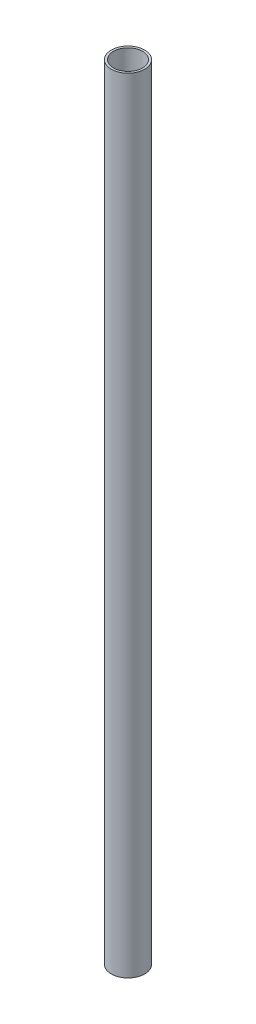
ISO-10303-21;
HEADER;
FILE_DESCRIPTION(('STEP AP214'),'2;1');
FILE_NAME('part.step','',(''),(''),'','','');
FILE_SCHEMA(('AUTOMOTIVE_DESIGN { 1 0 10303 214 1 1 1 1 }'));
ENDSEC;
DATA;
#1=APPLICATION_CONTEXT('core data for automotive mechanical design processes');
#2=APPLICATION_PROTOCOL_DEFINITION('international standard','automotive_design',2000,#1);
#3=PRODUCT_CONTEXT('',#1,'mechanical');
#4=PRODUCT('Part','Part','',(#3));
#5=PRODUCT_RELATED_PRODUCT_CATEGORY('part','',(#4));
#6=PRODUCT_DEFINITION_FORMATION('','',#4);
#7=PRODUCT_DEFINITION_CONTEXT('part definition',#1,'design');
#8=PRODUCT_DEFINITION('design','',#6,#7);
#9=PRODUCT_DEFINITION_SHAPE('','',#8);
#10=(LENGTH_UNIT() NAMED_UNIT(*) SI_UNIT(.MILLI.,.METRE.));
#11=(NAMED_UNIT(*) PLANE_ANGLE_UNIT() SI_UNIT($,.RADIAN.));
#12=(NAMED_UNIT(*) SI_UNIT($,.STERADIAN.) SOLID_ANGLE_UNIT());
#13=UNCERTAINTY_MEASURE_WITH_UNIT(LENGTH_MEASURE(1.E-05),#10,'distance_accuracy_value','');
#14=(GEOMETRIC_REPRESENTATION_CONTEXT(3) GLOBAL_UNCERTAINTY_ASSIGNED_CONTEXT((#13)) GLOBAL_UNIT_ASSIGNED_CONTEXT((#10,
#11,#12)) REPRESENTATION_CONTEXT('',''));
#15=CARTESIAN_POINT('',(0.,0.,0.));
#16=DIRECTION('',(0.,0.,1.));
#17=DIRECTION('',(1.,0.,0.));
#18=AXIS2_PLACEMENT_3D('',#15,#16,#17);
#19=CARTESIAN_POINT('',(0.,501.65,0.));
#20=DIRECTION('',(0.,1.,0.));
#21=DIRECTION('',(0.,0.,1.));
#22=AXIS2_PLACEMENT_3D('',#19,#20,#21);
#23=PLANE('',#22);
#24=CARTESIAN_POINT('',(0.,501.65,0.));
#25=DIRECTION('',(0.,1.,0.));
#26=DIRECTION('',(0.,0.,1.));
#27=AXIS2_PLACEMENT_3D('',#24,#25,#26);
#28=CIRCLE('',#27,10.668);
#29=CARTESIAN_POINT('',(0.,501.65,10.668));
#30=VERTEX_POINT('',#29);
#31=EDGE_CURVE('E10',#30,#30,#28,.T.);
#32=ORIENTED_EDGE('',*,*,#31,.T.);
#33=EDGE_LOOP('',(#32));
#34=FACE_BOUND('',#33,.T.);
#35=CARTESIAN_POINT('',(0.,501.65,0.));
#36=DIRECTION('',(0.,1.,0.));
#37=DIRECTION('',(0.,0.,1.));
#38=AXIS2_PLACEMENT_3D('',#35,#36,#37);
#39=CIRCLE('',#38,9.271);
#40=CARTESIAN_POINT('',(0.,501.65,9.271));
#41=VERTEX_POINT('',#40);
#42=EDGE_CURVE('E42',#41,#41,#39,.T.);
#43=ORIENTED_EDGE('',*,*,#42,.F.);
#44=EDGE_LOOP('',(#43));
#45=FACE_BOUND('',#44,.T.);
#46=ADVANCED_FACE('F31',(#34,#45),#23,.T.);
#47=CARTESIAN_POINT('',(0.,0.,0.));
#48=DIRECTION('',(0.,1.,0.));
#49=DIRECTION('',(0.,0.,1.));
#50=AXIS2_PLACEMENT_3D('',#47,#48,#49);
#51=PLANE('',#50);
#52=CARTESIAN_POINT('',(0.,0.,0.));
#53=DIRECTION('',(0.,1.,0.));
#54=DIRECTION('',(0.,0.,1.));
#55=AXIS2_PLACEMENT_3D('',#52,#53,#54);
#56=CIRCLE('',#55,10.668);
#57=CARTESIAN_POINT('',(0.,0.,10.668));
#58=VERTEX_POINT('',#57);
#59=EDGE_CURVE('E35',#58,#58,#56,.T.);
#60=ORIENTED_EDGE('',*,*,#59,.F.);
#61=EDGE_LOOP('',(#60));
#62=FACE_BOUND('',#61,.T.);
#63=CARTESIAN_POINT('',(0.,0.,0.));
#64=DIRECTION('',(0.,1.,0.));
#65=DIRECTION('',(0.,0.,1.));
#66=AXIS2_PLACEMENT_3D('',#63,#64,#65);
#67=CIRCLE('',#66,9.271);
#68=CARTESIAN_POINT('',(0.,0.,9.271));
#69=VERTEX_POINT('',#68);
#70=EDGE_CURVE('E44',#69,#69,#67,.T.);
#71=ORIENTED_EDGE('',*,*,#70,.T.);
#72=EDGE_LOOP('',(#71));
#73=FACE_BOUND('',#72,.T.);
#74=ADVANCED_FACE('F54',(#62,#73),#51,.F.);
#75=CARTESIAN_POINT('',(0.,501.65,0.));
#76=DIRECTION('',(0.,-1.,0.));
#77=DIRECTION('',(0.,0.,-1.));
#78=AXIS2_PLACEMENT_3D('',#75,#76,#77);
#79=CYLINDRICAL_SURFACE('',#78,10.668);
#80=ORIENTED_EDGE('',*,*,#31,.F.);
#81=EDGE_LOOP('',(#80));
#82=FACE_BOUND('',#81,.T.);
#83=ORIENTED_EDGE('',*,*,#59,.T.);
#84=EDGE_LOOP('',(#83));
#85=FACE_BOUND('',#84,.T.);
#86=ADVANCED_FACE('F33',(#82,#85),#79,.T.);
#87=CARTESIAN_POINT('',(0.,501.65,0.));
#88=DIRECTION('',(0.,-1.,0.));
#89=DIRECTION('',(0.,0.,-1.));
#90=AXIS2_PLACEMENT_3D('',#87,#88,#89);
#91=CYLINDRICAL_SURFACE('',#90,9.271);
#92=ORIENTED_EDGE('',*,*,#42,.T.);
#93=EDGE_LOOP('',(#92));
#94=FACE_BOUND('',#93,.T.);
#95=ORIENTED_EDGE('',*,*,#70,.F.);
#96=EDGE_LOOP('',(#95));
#97=FACE_BOUND('',#96,.T.);
#98=ADVANCED_FACE('F50',(#94,#97),#91,.F.);
#99=CLOSED_SHELL('',(#46,#74,#86,#98));
#100=MANIFOLD_SOLID_BREP('B2',#99);
#101=ADVANCED_BREP_SHAPE_REPRESENTATION('',(#18,#100),#14);
#102=SHAPE_DEFINITION_REPRESENTATION(#9,#101);
ENDSEC;
END-ISO-10303-21;
